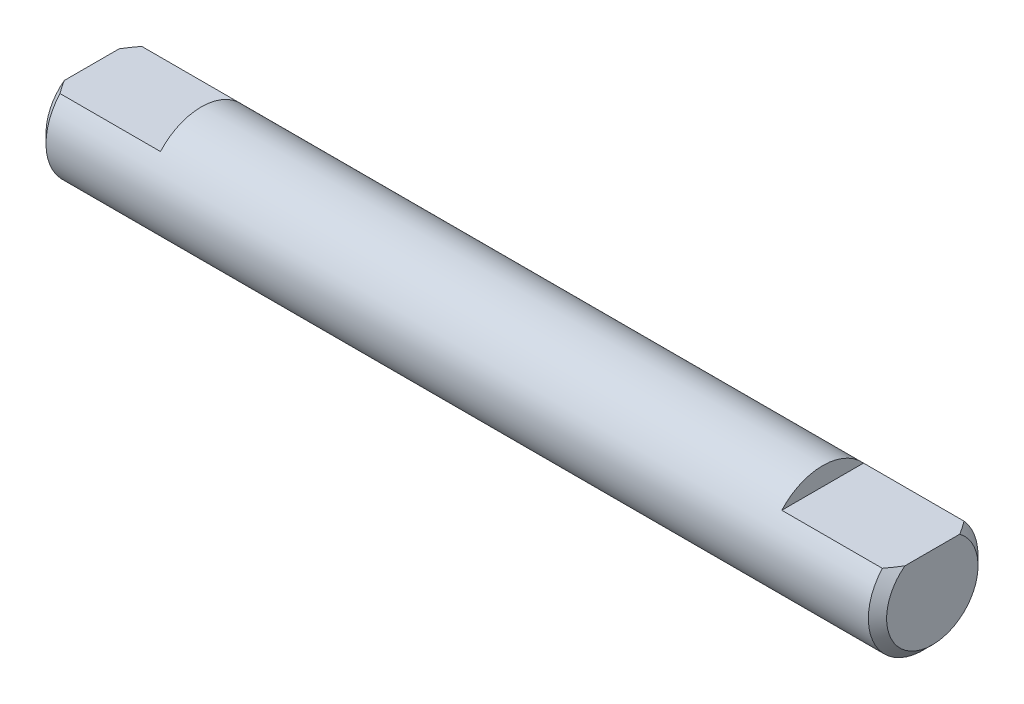
ISO-10303-21;
HEADER;
FILE_DESCRIPTION(('STEP AP214'),'2;1');
FILE_NAME('part.step','',(''),(''),'','','');
FILE_SCHEMA(('AUTOMOTIVE_DESIGN { 1 0 10303 214 1 1 1 1 }'));
ENDSEC;
DATA;
#1=APPLICATION_CONTEXT('core data for automotive mechanical design processes');
#2=APPLICATION_PROTOCOL_DEFINITION('international standard','automotive_design',2000,#1);
#3=PRODUCT_CONTEXT('',#1,'mechanical');
#4=PRODUCT('Part','Part','',(#3));
#5=PRODUCT_RELATED_PRODUCT_CATEGORY('part','',(#4));
#6=PRODUCT_DEFINITION_FORMATION('','',#4);
#7=PRODUCT_DEFINITION_CONTEXT('part definition',#1,'design');
#8=PRODUCT_DEFINITION('design','',#6,#7);
#9=PRODUCT_DEFINITION_SHAPE('','',#8);
#10=(LENGTH_UNIT() NAMED_UNIT(*) SI_UNIT(.MILLI.,.METRE.));
#11=(NAMED_UNIT(*) PLANE_ANGLE_UNIT() SI_UNIT($,.RADIAN.));
#12=(NAMED_UNIT(*) SI_UNIT($,.STERADIAN.) SOLID_ANGLE_UNIT());
#13=UNCERTAINTY_MEASURE_WITH_UNIT(LENGTH_MEASURE(1.E-05),#10,'distance_accuracy_value','');
#14=(GEOMETRIC_REPRESENTATION_CONTEXT(3) GLOBAL_UNCERTAINTY_ASSIGNED_CONTEXT((#13)) GLOBAL_UNIT_ASSIGNED_CONTEXT((#10,
#11,#12)) REPRESENTATION_CONTEXT('',''));
#15=CARTESIAN_POINT('',(0.,0.,0.));
#16=DIRECTION('',(0.,0.,1.));
#17=DIRECTION('',(1.,0.,0.));
#18=AXIS2_PLACEMENT_3D('',#15,#16,#17);
#19=CARTESIAN_POINT('',(23.,0.,0.));
#20=DIRECTION('',(-1.,0.,0.));
#21=DIRECTION('',(0.,0.,1.));
#22=AXIS2_PLACEMENT_3D('',#19,#20,#21);
#23=CYLINDRICAL_SURFACE('',#22,3.);
#24=CARTESIAN_POINT('',(22.5,0.,0.));
#25=DIRECTION('',(1.,0.,0.));
#26=DIRECTION('',(0.,0.,-1.));
#27=AXIS2_PLACEMENT_3D('',#24,#25,#26);
#28=CIRCLE('',#27,3.);
#29=CARTESIAN_POINT('',(22.5,2.,-2.23606797749979));
#30=VERTEX_POINT('',#29);
#31=CARTESIAN_POINT('',(22.5,2.,2.23606797749979));
#32=VERTEX_POINT('',#31);
#33=EDGE_CURVE('E119',#30,#32,#28,.F.);
#34=ORIENTED_EDGE('',*,*,#33,.T.);
#35=DIRECTION('',(1.,0.,0.));
#36=VECTOR('',#35,1.);
#37=CARTESIAN_POINT('',(17.,2.,2.23606797749979));
#38=LINE('',#37,#36);
#39=CARTESIAN_POINT('',(17.,2.,2.23606797749979));
#40=VERTEX_POINT('',#39);
#41=EDGE_CURVE('E114',#40,#32,#38,.T.);
#42=ORIENTED_EDGE('',*,*,#41,.F.);
#43=CARTESIAN_POINT('',(17.,0.,0.));
#44=DIRECTION('',(1.,0.,0.));
#45=DIRECTION('',(0.,0.,-1.));
#46=AXIS2_PLACEMENT_3D('',#43,#44,#45);
#47=CIRCLE('',#46,3.);
#48=CARTESIAN_POINT('',(17.,2.,-2.23606797749979));
#49=VERTEX_POINT('',#48);
#50=EDGE_CURVE('E109',#49,#40,#47,.T.);
#51=ORIENTED_EDGE('',*,*,#50,.F.);
#52=DIRECTION('',(1.,0.,0.));
#53=VECTOR('',#52,1.);
#54=CARTESIAN_POINT('',(17.,2.,-2.23606797749979));
#55=LINE('',#54,#53);
#56=EDGE_CURVE('E116',#49,#30,#55,.T.);
#57=ORIENTED_EDGE('',*,*,#56,.T.);
#58=EDGE_LOOP('',(#34,#42,#51,#57));
#59=FACE_BOUND('',#58,.T.);
#60=DIRECTION('',(-1.,0.,0.));
#61=VECTOR('',#60,1.);
#62=CARTESIAN_POINT('',(-17.,2.,-2.23606797749979));
#63=LINE('',#62,#61);
#64=CARTESIAN_POINT('',(-17.,2.,-2.23606797749979));
#65=VERTEX_POINT('',#64);
#66=CARTESIAN_POINT('',(-22.5,2.,-2.23606797749979));
#67=VERTEX_POINT('',#66);
#68=EDGE_CURVE('E53',#65,#67,#63,.T.);
#69=ORIENTED_EDGE('',*,*,#68,.F.);
#70=CARTESIAN_POINT('',(-17.,0.,0.));
#71=DIRECTION('',(1.,0.,0.));
#72=DIRECTION('',(0.,0.,-1.));
#73=AXIS2_PLACEMENT_3D('',#70,#71,#72);
#74=CIRCLE('',#73,3.);
#75=CARTESIAN_POINT('',(-17.,2.,2.23606797749979));
#76=VERTEX_POINT('',#75);
#77=EDGE_CURVE('E96',#65,#76,#74,.T.);
#78=ORIENTED_EDGE('',*,*,#77,.T.);
#79=DIRECTION('',(-1.,0.,0.));
#80=VECTOR('',#79,1.);
#81=CARTESIAN_POINT('',(-17.,2.,2.23606797749979));
#82=LINE('',#81,#80);
#83=CARTESIAN_POINT('',(-22.5,2.,2.23606797749979));
#84=VERTEX_POINT('',#83);
#85=EDGE_CURVE('E93',#76,#84,#82,.T.);
#86=ORIENTED_EDGE('',*,*,#85,.T.);
#87=CARTESIAN_POINT('',(-22.5,0.,0.));
#88=DIRECTION('',(1.,0.,0.));
#89=DIRECTION('',(0.,0.,-1.));
#90=AXIS2_PLACEMENT_3D('',#87,#88,#89);
#91=CIRCLE('',#90,3.);
#92=EDGE_CURVE('E104',#84,#67,#91,.T.);
#93=ORIENTED_EDGE('',*,*,#92,.T.);
#94=EDGE_LOOP('',(#69,#78,#86,#93));
#95=FACE_BOUND('',#94,.T.);
#96=ADVANCED_FACE('F32',(#59,#95),#23,.T.);
#97=CARTESIAN_POINT('',(-23.,0.,0.));
#98=DIRECTION('',(1.,0.,0.));
#99=DIRECTION('',(0.,0.,-1.));
#100=AXIS2_PLACEMENT_3D('',#97,#98,#99);
#101=PLANE('',#100);
#102=DIRECTION('',(0.,0.,-1.));
#103=VECTOR('',#102,1.);
#104=CARTESIAN_POINT('',(-23.,2.,2.23606797749979));
#105=LINE('',#104,#103);
#106=CARTESIAN_POINT('',(-23.,2.,1.49999999999999));
#107=VERTEX_POINT('',#106);
#108=CARTESIAN_POINT('',(-23.,2.,-1.49999999999999));
#109=VERTEX_POINT('',#108);
#110=EDGE_CURVE('E100',#107,#109,#105,.T.);
#111=ORIENTED_EDGE('',*,*,#110,.T.);
#112=CARTESIAN_POINT('',(-23.,0.,0.));
#113=DIRECTION('',(1.,0.,0.));
#114=DIRECTION('',(0.,0.,-1.));
#115=AXIS2_PLACEMENT_3D('',#112,#113,#114);
#116=CIRCLE('',#115,2.5);
#117=EDGE_CURVE('E124',#109,#107,#116,.F.);
#118=ORIENTED_EDGE('',*,*,#117,.T.);
#119=EDGE_LOOP('',(#111,#118));
#120=FACE_BOUND('',#119,.T.);
#121=ADVANCED_FACE('F147',(#120),#101,.F.);
#122=CARTESIAN_POINT('',(-22.5,0.,0.));
#123=DIRECTION('',(1.,0.,0.));
#124=DIRECTION('',(0.,0.,-1.));
#125=AXIS2_PLACEMENT_3D('',#122,#123,#124);
#126=CONICAL_SURFACE('',#125,3.,0.785398163397453);
#127=ORIENTED_EDGE('',*,*,#92,.F.);
#128=CARTESIAN_POINT('',(-20.1739562951765,2.,4.93626797749979));
#129=CARTESIAN_POINT('',(-20.3116263102323,2.,4.78768381124845));
#130=CARTESIAN_POINT('',(-20.4488688001703,2.,4.63869756596274));
#131=CARTESIAN_POINT('',(-20.7221404063521,2.,4.33955728207182));
#132=CARTESIAN_POINT('',(-20.8581692492664,2.,4.18940299398388));
#133=CARTESIAN_POINT('',(-21.1294043369861,2.,3.88672415849227));
#134=CARTESIAN_POINT('',(-21.2646007730296,2.,3.7341908006299));
#135=CARTESIAN_POINT('',(-21.5326839106298,2.,3.42713160304089));
#136=CARTESIAN_POINT('',(-21.6655708826726,2.,3.27260600039062));
#137=CARTESIAN_POINT('',(-21.9016416051834,2.,2.99210640438999));
#138=CARTESIAN_POINT('',(-22.0054251811024,2.,2.86663901089742));
#139=CARTESIAN_POINT('',(-22.2100672620052,2.,2.61328277643715));
#140=CARTESIAN_POINT('',(-22.3109250532625,2.,2.48539335700055));
#141=CARTESIAN_POINT('',(-22.5082990419047,2.,2.22650548443354));
#142=CARTESIAN_POINT('',(-22.6048202373963,2.,2.09551089088955));
#143=CARTESIAN_POINT('',(-22.7447671190917,2.,1.89566419584527));
#144=CARTESIAN_POINT('',(-22.7906025013962,2.,1.82850179908417));
#145=CARTESIAN_POINT('',(-22.8802458696183,2.,1.69284128038712));
#146=CARTESIAN_POINT('',(-22.9240540801268,2.,1.62434330762087));
#147=CARTESIAN_POINT('',(-23.0077568287426,2.,1.48797798387183));
#148=CARTESIAN_POINT('',(-23.0477316201661,2.,1.42016017631462));
#149=CARTESIAN_POINT('',(-23.124626643768,2.,1.28282423563597));
#150=CARTESIAN_POINT('',(-23.1615475696607,2.,1.21330649334522));
#151=CARTESIAN_POINT('',(-23.2314815211118,2.,1.07234023444369));
#152=CARTESIAN_POINT('',(-23.264496175163,2.,1.00089253778239));
#153=CARTESIAN_POINT('',(-23.3255401133741,2.,0.855927305144264));
#154=CARTESIAN_POINT('',(-23.3535707912893,2.,0.782410354510817));
#155=CARTESIAN_POINT('',(-23.4173281170312,2.,0.591196656014601));
#156=CARTESIAN_POINT('',(-23.44853668053,2.,0.471874440503037));
#157=CARTESIAN_POINT('',(-23.4798985537804,2.,0.29046494903776));
#158=CARTESIAN_POINT('',(-23.4877770901142,2.,0.229673626127371));
#159=CARTESIAN_POINT('',(-23.4980276880383,2.,0.107614500574347));
#160=CARTESIAN_POINT('',(-23.5004000751751,2.,0.0463467263164129));
#161=CARTESIAN_POINT('',(-23.4994876340507,2.,-0.0763197942470411));
#162=CARTESIAN_POINT('',(-23.4961865331302,2.,-0.137718411127137));
#163=CARTESIAN_POINT('',(-23.4840927327863,2.,-0.259968375583744));
#164=CARTESIAN_POINT('',(-23.4752996010043,2.,-0.320819679690597));
#165=CARTESIAN_POINT('',(-23.4526584972667,2.,-0.441758386957281));
#166=CARTESIAN_POINT('',(-23.4387947934545,2.,-0.501842803788251));
#167=CARTESIAN_POINT('',(-23.4066497947718,2.,-0.620801694696728));
#168=CARTESIAN_POINT('',(-23.3883682885415,2.,-0.679676110738211));
#169=CARTESIAN_POINT('',(-23.32353373849,2.,-0.867010178133722));
#170=CARTESIAN_POINT('',(-23.269655609127,2.,-0.992934833748163));
#171=CARTESIAN_POINT('',(-23.1498194583963,2.,-1.23892735531403));
#172=CARTESIAN_POINT('',(-23.0838370471123,2.,-1.35898276485907));
#173=CARTESIAN_POINT('',(-22.9431293700758,2.,-1.59585458502195));
#174=CARTESIAN_POINT('',(-22.8683039830242,2.,-1.71261073718886));
#175=CARTESIAN_POINT('',(-22.7133369591881,2.,-1.94233316376558));
#176=CARTESIAN_POINT('',(-22.6332002257383,2.,-2.05530279263015));
#177=CARTESIAN_POINT('',(-22.4584536139599,2.,-2.29310526083198));
#178=CARTESIAN_POINT('',(-22.3633231135208,2.,-2.41755314631462));
#179=CARTESIAN_POINT('',(-22.169770359034,2.,-2.66387185446494));
#180=CARTESIAN_POINT('',(-22.0713476398,2.,-2.78574230894005));
#181=CARTESIAN_POINT('',(-21.8720580954331,2.,-3.02764935246811));
#182=CARTESIAN_POINT('',(-21.7711891086712,2.,-3.1476841545268));
#183=CARTESIAN_POINT('',(-21.5677067244689,2.,-3.38626695152414));
#184=CARTESIAN_POINT('',(-21.4650932831407,2.,-3.50481490892546));
#185=CARTESIAN_POINT('',(-21.2645083359917,2.,-3.73393503767579));
#186=CARTESIAN_POINT('',(-21.1666110971079,2.,-3.84457235346527));
#187=CARTESIAN_POINT('',(-20.9698872405432,2.,-4.06502066506251));
#188=CARTESIAN_POINT('',(-20.8710606043089,2.,-4.17483164429525));
#189=CARTESIAN_POINT('',(-20.672861613006,2.,-4.39356418106757));
#190=CARTESIAN_POINT('',(-20.5734907230783,2.,-4.50248706778863));
#191=CARTESIAN_POINT('',(-20.3741449318645,2.,-4.71977019005837));
#192=CARTESIAN_POINT('',(-20.2741700570922,2.,-4.82813044992246));
#193=CARTESIAN_POINT('',(-20.1739562951765,2.,-4.93626797749979));
#194=B_SPLINE_CURVE_WITH_KNOTS('',3,(#128,#129,#130,#131,#132,#133,#134,#135,#136,#137,#138,
#139,#140,#141,#142,#143,#144,#145,#146,#147,#148,#149,#150,#151,#152,#153,#154,#155,#156,#157,
#158,#159,#160,#161,#162,#163,#164,#165,#166,#167,#168,#169,#170,#171,#172,#173,#174,#175,#176,
#177,#178,#179,#180,#181,#182,#183,#184,#185,#186,#187,#188,#189,#190,#191,#192,#193),
.UNSPECIFIED.,.F.,.F.,(4,2,2,2,2,2,2,2,2,2,2,2,2,2,2,2,2,2,2,2,2,2,2,2,2,2,2,2,2,2,2,2,4),(0.,
0.607683822515699,1.21550121371796,1.82695959733875,2.43834587720767,2.92679827952437,
3.41536885142094,3.90336106917611,4.14727001406465,4.39115187121075,4.62725676477008,
4.8633078767331,5.09926023157598,5.3351464988601,5.70350071953636,5.88718743593395,
6.07086329173092,6.25506684494245,6.43928490135032,6.62407942586771,6.80888279321208,
7.21864694206688,7.62924601323275,8.04504397302752,8.46046328332831,8.93031101628631,
9.40022542091199,9.87057139026389,10.3409292103109,10.7841162696073,11.2273121949651,
11.6696319276303,12.1119323824531),.UNSPECIFIED.);
#195=EDGE_CURVE('E11',#84,#107,#194,.T.);
#196=ORIENTED_EDGE('',*,*,#195,.T.);
#197=ORIENTED_EDGE('',*,*,#117,.F.);
#198=EDGE_CURVE('E37',#109,#67,#194,.T.);
#199=ORIENTED_EDGE('',*,*,#198,.T.);
#200=EDGE_LOOP('',(#127,#196,#197,#199));
#201=FACE_BOUND('',#200,.T.);
#202=ADVANCED_FACE('F145',(#201),#126,.T.);
#203=CARTESIAN_POINT('',(23.,0.,0.));
#204=DIRECTION('',(1.,0.,0.));
#205=DIRECTION('',(0.,0.,-1.));
#206=AXIS2_PLACEMENT_3D('',#203,#204,#205);
#207=PLANE('',#206);
#208=DIRECTION('',(0.,0.,-1.));
#209=VECTOR('',#208,1.);
#210=CARTESIAN_POINT('',(23.,2.,2.23606797749979));
#211=LINE('',#210,#209);
#212=CARTESIAN_POINT('',(23.,2.,1.49999999999999));
#213=VERTEX_POINT('',#212);
#214=CARTESIAN_POINT('',(23.,2.,-1.49999999999999));
#215=VERTEX_POINT('',#214);
#216=EDGE_CURVE('E61',#213,#215,#211,.T.);
#217=ORIENTED_EDGE('',*,*,#216,.F.);
#218=CARTESIAN_POINT('',(23.,0.,0.));
#219=DIRECTION('',(1.,0.,0.));
#220=DIRECTION('',(0.,0.,-1.));
#221=AXIS2_PLACEMENT_3D('',#218,#219,#220);
#222=CIRCLE('',#221,2.5);
#223=EDGE_CURVE('E127',#213,#215,#222,.T.);
#224=ORIENTED_EDGE('',*,*,#223,.T.);
#225=EDGE_LOOP('',(#217,#224));
#226=FACE_BOUND('',#225,.T.);
#227=ADVANCED_FACE('F142',(#226),#207,.T.);
#228=CARTESIAN_POINT('',(23.,0.,0.));
#229=DIRECTION('',(-1.,0.,0.));
#230=DIRECTION('',(0.,0.,1.));
#231=AXIS2_PLACEMENT_3D('',#228,#229,#230);
#232=CONICAL_SURFACE('',#231,2.5,0.785398163397453);
#233=CARTESIAN_POINT('',(20.1739562951765,2.,4.93626797749979));
#234=CARTESIAN_POINT('',(20.3116263102323,2.,4.78768381124845));
#235=CARTESIAN_POINT('',(20.4488688001703,2.,4.63869756596274));
#236=CARTESIAN_POINT('',(20.7221404063521,2.,4.33955728207182));
#237=CARTESIAN_POINT('',(20.8581692492664,2.,4.18940299398388));
#238=CARTESIAN_POINT('',(21.1294043369861,2.,3.88672415849227));
#239=CARTESIAN_POINT('',(21.2646007730296,2.,3.7341908006299));
#240=CARTESIAN_POINT('',(21.5326839106298,2.,3.42713160304089));
#241=CARTESIAN_POINT('',(21.6655708826726,2.,3.27260600039062));
#242=CARTESIAN_POINT('',(21.9016416051834,2.,2.99210640438998));
#243=CARTESIAN_POINT('',(22.0054251811024,2.,2.86663901089742));
#244=CARTESIAN_POINT('',(22.2100672620052,2.,2.61328277643715));
#245=CARTESIAN_POINT('',(22.3109250532625,2.,2.48539335700054));
#246=CARTESIAN_POINT('',(22.5082990419047,2.,2.22650548443353));
#247=CARTESIAN_POINT('',(22.6048202373963,2.,2.09551089088955));
#248=CARTESIAN_POINT('',(22.7447671190917,2.,1.89566419584526));
#249=CARTESIAN_POINT('',(22.7906025013962,2.,1.82850179908416));
#250=CARTESIAN_POINT('',(22.8802458696183,2.,1.69284128038711));
#251=CARTESIAN_POINT('',(22.9240540801269,2.,1.62434330762086));
#252=CARTESIAN_POINT('',(23.0077568287426,2.,1.48797798387182));
#253=CARTESIAN_POINT('',(23.0477316201661,2.,1.42016017631462));
#254=CARTESIAN_POINT('',(23.124626643768,2.,1.28282423563596));
#255=CARTESIAN_POINT('',(23.1615475696607,2.,1.21330649334521));
#256=CARTESIAN_POINT('',(23.2314815211118,2.,1.07234023444368));
#257=CARTESIAN_POINT('',(23.264496175163,2.,1.00089253778239));
#258=CARTESIAN_POINT('',(23.3255401133741,2.,0.855927305144259));
#259=CARTESIAN_POINT('',(23.3535707912893,2.,0.782410354510812));
#260=CARTESIAN_POINT('',(23.4173281170312,2.,0.591196656014596));
#261=CARTESIAN_POINT('',(23.44853668053,2.,0.471874440503033));
#262=CARTESIAN_POINT('',(23.4798985537804,2.,0.290464949037756));
#263=CARTESIAN_POINT('',(23.4877770901142,2.,0.229673626127367));
#264=CARTESIAN_POINT('',(23.4980276880383,2.,0.107614500574343));
#265=CARTESIAN_POINT('',(23.5004000751751,2.,0.046346726316409));
#266=CARTESIAN_POINT('',(23.4994876340507,2.,-0.0763197942470449));
#267=CARTESIAN_POINT('',(23.4961865331302,2.,-0.13771841112714));
#268=CARTESIAN_POINT('',(23.4840927327863,2.,-0.259968375583747));
#269=CARTESIAN_POINT('',(23.4752996010043,2.,-0.3208196796906));
#270=CARTESIAN_POINT('',(23.4526584972667,2.,-0.441758386957283));
#271=CARTESIAN_POINT('',(23.4387947934545,2.,-0.501842803788254));
#272=CARTESIAN_POINT('',(23.4066497947718,2.,-0.62080169469673));
#273=CARTESIAN_POINT('',(23.3883682885415,2.,-0.679676110738213));
#274=CARTESIAN_POINT('',(23.32353373849,2.,-0.867010178133724));
#275=CARTESIAN_POINT('',(23.269655609127,2.,-0.992934833748166));
#276=CARTESIAN_POINT('',(23.1498194583963,2.,-1.23892735531404));
#277=CARTESIAN_POINT('',(23.0838370471123,2.,-1.35898276485907));
#278=CARTESIAN_POINT('',(22.9431293700758,2.,-1.59585458502195));
#279=CARTESIAN_POINT('',(22.8683039830242,2.,-1.71261073718886));
#280=CARTESIAN_POINT('',(22.7133369591881,2.,-1.94233316376559));
#281=CARTESIAN_POINT('',(22.6332002257383,2.,-2.05530279263015));
#282=CARTESIAN_POINT('',(22.4584536139599,2.,-2.29310526083199));
#283=CARTESIAN_POINT('',(22.3633231135208,2.,-2.41755314631463));
#284=CARTESIAN_POINT('',(22.169770359034,2.,-2.66387185446495));
#285=CARTESIAN_POINT('',(22.0713476398,2.,-2.78574230894005));
#286=CARTESIAN_POINT('',(21.8720580954331,2.,-3.02764935246811));
#287=CARTESIAN_POINT('',(21.7711891086712,2.,-3.1476841545268));
#288=CARTESIAN_POINT('',(21.5677067244689,2.,-3.38626695152415));
#289=CARTESIAN_POINT('',(21.4650932831407,2.,-3.50481490892546));
#290=CARTESIAN_POINT('',(21.2645083359917,2.,-3.73393503767579));
#291=CARTESIAN_POINT('',(21.1666110971079,2.,-3.84457235346528));
#292=CARTESIAN_POINT('',(20.9698872405432,2.,-4.06502066506251));
#293=CARTESIAN_POINT('',(20.8710606043089,2.,-4.17483164429525));
#294=CARTESIAN_POINT('',(20.672861613006,2.,-4.39356418106757));
#295=CARTESIAN_POINT('',(20.5734907230783,2.,-4.50248706778863));
#296=CARTESIAN_POINT('',(20.3741449318645,2.,-4.71977019005837));
#297=CARTESIAN_POINT('',(20.2741700570922,2.,-4.82813044992246));
#298=CARTESIAN_POINT('',(20.1739562951765,2.,-4.93626797749979));
#299=B_SPLINE_CURVE_WITH_KNOTS('',3,(#233,#234,#235,#236,#237,#238,#239,#240,#241,#242,#243,
#244,#245,#246,#247,#248,#249,#250,#251,#252,#253,#254,#255,#256,#257,#258,#259,#260,#261,#262,
#263,#264,#265,#266,#267,#268,#269,#270,#271,#272,#273,#274,#275,#276,#277,#278,#279,#280,#281,
#282,#283,#284,#285,#286,#287,#288,#289,#290,#291,#292,#293,#294,#295,#296,#297,#298),
.UNSPECIFIED.,.F.,.F.,(4,2,2,2,2,2,2,2,2,2,2,2,2,2,2,2,2,2,2,2,2,2,2,2,2,2,2,2,2,2,2,2,4),(0.,
0.607683822515696,1.21550121371796,1.82695959733875,2.43834587720767,2.92679827952437,
3.41536885142094,3.90336106917612,4.14727001406466,4.39115187121076,4.62725676477008,
4.8633078767331,5.09926023157598,5.3351464988601,5.70350071953636,5.88718743593395,
6.07086329173092,6.25506684494245,6.43928490135031,6.62407942586771,6.80888279321207,
7.21864694206688,7.62924601323275,8.04504397302752,8.46046328332831,8.93031101628632,
9.40022542091199,9.87057139026389,10.3409292103109,10.7841162696073,11.2273121949651,
11.6696319276303,12.1119323824531),.UNSPECIFIED.);
#300=EDGE_CURVE('E135',#32,#213,#299,.T.);
#301=ORIENTED_EDGE('',*,*,#300,.F.);
#302=ORIENTED_EDGE('',*,*,#33,.F.);
#303=EDGE_CURVE('E129',#215,#30,#299,.T.);
#304=ORIENTED_EDGE('',*,*,#303,.F.);
#305=ORIENTED_EDGE('',*,*,#223,.F.);
#306=EDGE_LOOP('',(#301,#302,#304,#305));
#307=FACE_BOUND('',#306,.T.);
#308=ADVANCED_FACE('F34',(#307),#232,.T.);
#309=CARTESIAN_POINT('',(17.,2.,2.23606797749979));
#310=DIRECTION('',(0.,-1.,0.));
#311=DIRECTION('',(0.,0.,-1.));
#312=AXIS2_PLACEMENT_3D('',#309,#310,#311);
#313=PLANE('',#312);
#314=ORIENTED_EDGE('',*,*,#300,.T.);
#315=ORIENTED_EDGE('',*,*,#216,.T.);
#316=ORIENTED_EDGE('',*,*,#303,.T.);
#317=ORIENTED_EDGE('',*,*,#56,.F.);
#318=DIRECTION('',(0.,0.,-1.));
#319=VECTOR('',#318,1.);
#320=CARTESIAN_POINT('',(17.,2.,2.23606797749979));
#321=LINE('',#320,#319);
#322=EDGE_CURVE('E111',#40,#49,#321,.T.);
#323=ORIENTED_EDGE('',*,*,#322,.F.);
#324=ORIENTED_EDGE('',*,*,#41,.T.);
#325=EDGE_LOOP('',(#314,#315,#316,#317,#323,#324));
#326=FACE_BOUND('',#325,.T.);
#327=ADVANCED_FACE('F136',(#326),#313,.F.);
#328=CARTESIAN_POINT('',(17.,0.,0.));
#329=DIRECTION('',(1.,0.,0.));
#330=DIRECTION('',(0.,0.,-1.));
#331=AXIS2_PLACEMENT_3D('',#328,#329,#330);
#332=PLANE('',#331);
#333=ORIENTED_EDGE('',*,*,#50,.T.);
#334=ORIENTED_EDGE('',*,*,#322,.T.);
#335=EDGE_LOOP('',(#333,#334));
#336=FACE_BOUND('',#335,.T.);
#337=ADVANCED_FACE('F141',(#336),#332,.T.);
#338=CARTESIAN_POINT('',(-17.,2.,2.23606797749979));
#339=DIRECTION('',(0.,1.,0.));
#340=DIRECTION('',(0.,0.,1.));
#341=AXIS2_PLACEMENT_3D('',#338,#339,#340);
#342=PLANE('',#341);
#343=ORIENTED_EDGE('',*,*,#85,.F.);
#344=DIRECTION('',(0.,0.,-1.));
#345=VECTOR('',#344,1.);
#346=CARTESIAN_POINT('',(-17.,2.,2.23606797749979));
#347=LINE('',#346,#345);
#348=EDGE_CURVE('E89',#76,#65,#347,.T.);
#349=ORIENTED_EDGE('',*,*,#348,.T.);
#350=ORIENTED_EDGE('',*,*,#68,.T.);
#351=ORIENTED_EDGE('',*,*,#198,.F.);
#352=ORIENTED_EDGE('',*,*,#110,.F.);
#353=ORIENTED_EDGE('',*,*,#195,.F.);
#354=EDGE_LOOP('',(#343,#349,#350,#351,#352,#353));
#355=FACE_BOUND('',#354,.T.);
#356=ADVANCED_FACE('F91',(#355),#342,.T.);
#357=CARTESIAN_POINT('',(-17.,0.,0.));
#358=DIRECTION('',(-1.,0.,0.));
#359=DIRECTION('',(0.,0.,-1.));
#360=AXIS2_PLACEMENT_3D('',#357,#358,#359);
#361=PLANE('',#360);
#362=ORIENTED_EDGE('',*,*,#77,.F.);
#363=ORIENTED_EDGE('',*,*,#348,.F.);
#364=EDGE_LOOP('',(#362,#363));
#365=FACE_BOUND('',#364,.T.);
#366=ADVANCED_FACE('F98',(#365),#361,.T.);
#367=CLOSED_SHELL('',(#96,#121,#202,#227,#308,#327,#337,#356,#366));
#368=MANIFOLD_SOLID_BREP('B2',#367);
#369=ADVANCED_BREP_SHAPE_REPRESENTATION('',(#18,#368),#14);
#370=SHAPE_DEFINITION_REPRESENTATION(#9,#369);
ENDSEC;
END-ISO-10303-21;
